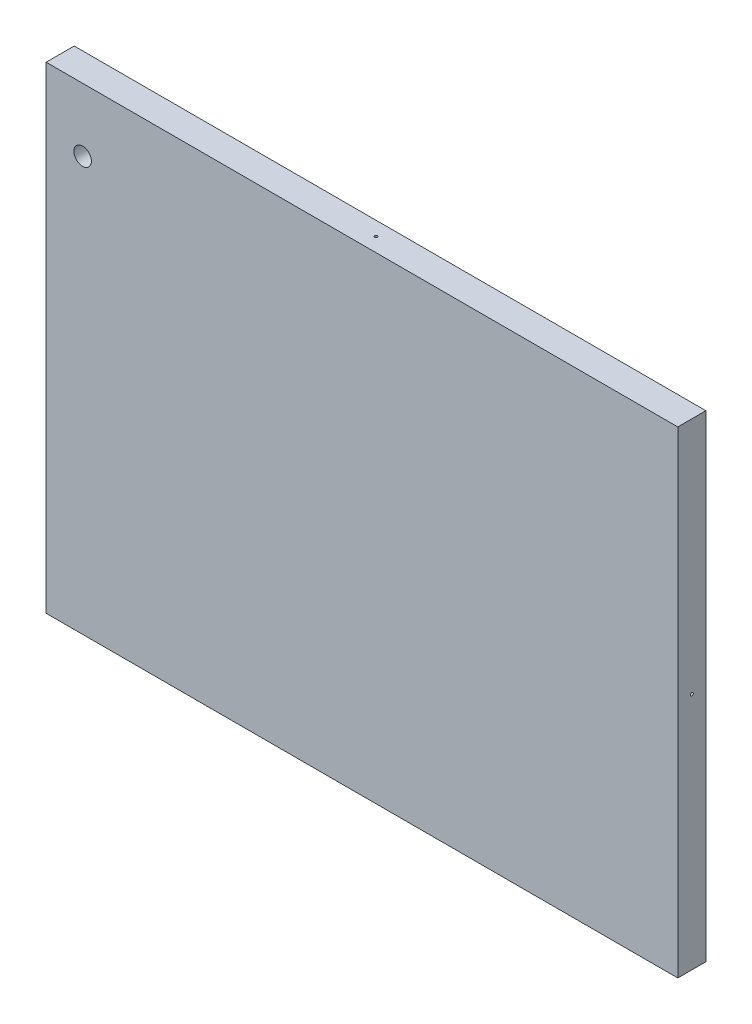
ISO-10303-21;
HEADER;
FILE_DESCRIPTION(('STEP AP214'),'2;1');
FILE_NAME('part.step','',(''),(''),'','','');
FILE_SCHEMA(('AUTOMOTIVE_DESIGN { 1 0 10303 214 1 1 1 1 }'));
ENDSEC;
DATA;
#1=APPLICATION_CONTEXT('core data for automotive mechanical design processes');
#2=APPLICATION_PROTOCOL_DEFINITION('international standard','automotive_design',2000,#1);
#3=PRODUCT_CONTEXT('',#1,'mechanical');
#4=PRODUCT('Part','Part','',(#3));
#5=PRODUCT_RELATED_PRODUCT_CATEGORY('part','',(#4));
#6=PRODUCT_DEFINITION_FORMATION('','',#4);
#7=PRODUCT_DEFINITION_CONTEXT('part definition',#1,'design');
#8=PRODUCT_DEFINITION('design','',#6,#7);
#9=PRODUCT_DEFINITION_SHAPE('','',#8);
#10=(LENGTH_UNIT() NAMED_UNIT(*) SI_UNIT(.MILLI.,.METRE.));
#11=(NAMED_UNIT(*) PLANE_ANGLE_UNIT() SI_UNIT($,.RADIAN.));
#12=(NAMED_UNIT(*) SI_UNIT($,.STERADIAN.) SOLID_ANGLE_UNIT());
#13=UNCERTAINTY_MEASURE_WITH_UNIT(LENGTH_MEASURE(1.E-05),#10,'distance_accuracy_value','');
#14=(GEOMETRIC_REPRESENTATION_CONTEXT(3) GLOBAL_UNCERTAINTY_ASSIGNED_CONTEXT((#13)) GLOBAL_UNIT_ASSIGNED_CONTEXT((#10,
#11,#12)) REPRESENTATION_CONTEXT('',''));
#15=CARTESIAN_POINT('',(0.,0.,0.));
#16=DIRECTION('',(0.,0.,1.));
#17=DIRECTION('',(1.,0.,0.));
#18=AXIS2_PLACEMENT_3D('',#15,#16,#17);
#19=CARTESIAN_POINT('',(0.,-340.,20.));
#20=DIRECTION('',(0.,-1.,0.));
#21=DIRECTION('',(0.,0.,-1.));
#22=AXIS2_PLACEMENT_3D('',#19,#20,#21);
#23=CYLINDRICAL_SURFACE('',#22,2.09999999999992);
#24=CARTESIAN_POINT('',(0.,-340.,20.));
#25=DIRECTION('',(0.,-1.,0.));
#26=DIRECTION('',(0.,0.,-1.));
#27=AXIS2_PLACEMENT_3D('',#24,#25,#26);
#28=CIRCLE('',#27,2.09999999999999);
#29=CARTESIAN_POINT('',(0.,-340.,17.9));
#30=VERTEX_POINT('',#29);
#31=EDGE_CURVE('E134',#30,#30,#28,.T.);
#32=ORIENTED_EDGE('',*,*,#31,.T.);
#33=EDGE_LOOP('',(#32));
#34=FACE_BOUND('',#33,.T.);
#35=CARTESIAN_POINT('',(0.,0.,20.));
#36=DIRECTION('',(0.707106781186547,-0.707106781186547,0.));
#37=DIRECTION('',(-0.707106781186547,-0.707106781186547,0.));
#38=AXIS2_PLACEMENT_3D('',#35,#36,#37);
#39=ELLIPSE('',#38,2.9698484809834,2.09999999999993);
#40=CARTESIAN_POINT('',(0.,0.,17.9000000000001));
#41=VERTEX_POINT('',#40);
#42=CARTESIAN_POINT('',(0.,0.,22.0999999999999));
#43=VERTEX_POINT('',#42);
#44=EDGE_CURVE('E53',#41,#43,#39,.F.);
#45=ORIENTED_EDGE('',*,*,#44,.T.);
#46=CARTESIAN_POINT('',(0.,0.,20.));
#47=DIRECTION('',(-0.707106781186547,-0.707106781186547,0.));
#48=DIRECTION('',(0.707106781186547,-0.707106781186547,0.));
#49=AXIS2_PLACEMENT_3D('',#46,#47,#48);
#50=ELLIPSE('',#49,2.9698484809834,2.09999999999993);
#51=EDGE_CURVE('E11',#43,#41,#50,.F.);
#52=ORIENTED_EDGE('',*,*,#51,.T.);
#53=EDGE_LOOP('',(#45,#52));
#54=FACE_BOUND('',#53,.T.);
#55=ADVANCED_FACE('F40',(#34,#54),#23,.F.);
#56=CARTESIAN_POINT('',(450.,340.,40.));
#57=DIRECTION('',(-1.,0.,0.));
#58=DIRECTION('',(0.,-1.,0.));
#59=AXIS2_PLACEMENT_3D('',#56,#57,#58);
#60=PLANE('',#59);
#61=CARTESIAN_POINT('',(450.,0.,20.));
#62=DIRECTION('',(-1.,0.,0.));
#63=DIRECTION('',(0.,0.,1.));
#64=AXIS2_PLACEMENT_3D('',#61,#62,#63);
#65=CIRCLE('',#64,2.09999999999989);
#66=CARTESIAN_POINT('',(450.,0.,22.0999999999999));
#67=VERTEX_POINT('',#66);
#68=EDGE_CURVE('E137',#67,#67,#65,.T.);
#69=ORIENTED_EDGE('',*,*,#68,.T.);
#70=EDGE_LOOP('',(#69));
#71=FACE_BOUND('',#70,.T.);
#72=DIRECTION('',(0.,1.,0.));
#73=VECTOR('',#72,1.);
#74=CARTESIAN_POINT('',(450.,340.,0.));
#75=LINE('',#74,#73);
#76=CARTESIAN_POINT('',(450.,-340.,0.));
#77=VERTEX_POINT('',#76);
#78=CARTESIAN_POINT('',(450.,340.,0.));
#79=VERTEX_POINT('',#78);
#80=EDGE_CURVE('E123',#77,#79,#75,.T.);
#81=ORIENTED_EDGE('',*,*,#80,.T.);
#82=DIRECTION('',(0.,0.,-1.));
#83=VECTOR('',#82,1.);
#84=CARTESIAN_POINT('',(450.,340.,40.));
#85=LINE('',#84,#83);
#86=CARTESIAN_POINT('',(450.,340.,40.));
#87=VERTEX_POINT('',#86);
#88=EDGE_CURVE('E104',#87,#79,#85,.T.);
#89=ORIENTED_EDGE('',*,*,#88,.F.);
#90=DIRECTION('',(0.,1.,0.));
#91=VECTOR('',#90,1.);
#92=CARTESIAN_POINT('',(450.,340.,40.));
#93=LINE('',#92,#91);
#94=CARTESIAN_POINT('',(450.,-340.,40.));
#95=VERTEX_POINT('',#94);
#96=EDGE_CURVE('E118',#95,#87,#93,.T.);
#97=ORIENTED_EDGE('',*,*,#96,.F.);
#98=DIRECTION('',(0.,0.,-1.));
#99=VECTOR('',#98,1.);
#100=CARTESIAN_POINT('',(450.,-340.,40.));
#101=LINE('',#100,#99);
#102=EDGE_CURVE('E115',#95,#77,#101,.T.);
#103=ORIENTED_EDGE('',*,*,#102,.T.);
#104=EDGE_LOOP('',(#81,#89,#97,#103));
#105=FACE_BOUND('',#104,.T.);
#106=ADVANCED_FACE('F42',(#71,#105),#60,.F.);
#107=CARTESIAN_POINT('',(-450.,340.,40.));
#108=DIRECTION('',(0.,-1.,0.));
#109=DIRECTION('',(0.,0.,-1.));
#110=AXIS2_PLACEMENT_3D('',#107,#108,#109);
#111=PLANE('',#110);
#112=CARTESIAN_POINT('',(0.,340.,20.));
#113=DIRECTION('',(0.,-1.,0.));
#114=DIRECTION('',(0.,0.,-1.));
#115=AXIS2_PLACEMENT_3D('',#112,#113,#114);
#116=CIRCLE('',#115,2.09999999999984);
#117=CARTESIAN_POINT('',(0.,340.,17.9000000000002));
#118=VERTEX_POINT('',#117);
#119=EDGE_CURVE('E126',#118,#118,#116,.T.);
#120=ORIENTED_EDGE('',*,*,#119,.T.);
#121=EDGE_LOOP('',(#120));
#122=FACE_BOUND('',#121,.T.);
#123=DIRECTION('',(-1.,0.,0.));
#124=VECTOR('',#123,1.);
#125=CARTESIAN_POINT('',(-450.,340.,0.));
#126=LINE('',#125,#124);
#127=CARTESIAN_POINT('',(-450.,340.,0.));
#128=VERTEX_POINT('',#127);
#129=EDGE_CURVE('E121',#79,#128,#126,.T.);
#130=ORIENTED_EDGE('',*,*,#129,.T.);
#131=DIRECTION('',(0.,0.,-1.));
#132=VECTOR('',#131,1.);
#133=CARTESIAN_POINT('',(-450.,340.,40.));
#134=LINE('',#133,#132);
#135=CARTESIAN_POINT('',(-450.,340.,40.));
#136=VERTEX_POINT('',#135);
#137=EDGE_CURVE('E110',#136,#128,#134,.T.);
#138=ORIENTED_EDGE('',*,*,#137,.F.);
#139=DIRECTION('',(-1.,0.,0.));
#140=VECTOR('',#139,1.);
#141=CARTESIAN_POINT('',(-450.,340.,40.));
#142=LINE('',#141,#140);
#143=EDGE_CURVE('E91',#87,#136,#142,.T.);
#144=ORIENTED_EDGE('',*,*,#143,.F.);
#145=ORIENTED_EDGE('',*,*,#88,.T.);
#146=EDGE_LOOP('',(#130,#138,#144,#145));
#147=FACE_BOUND('',#146,.T.);
#148=ADVANCED_FACE('F167',(#122,#147),#111,.F.);
#149=CARTESIAN_POINT('',(-450.,340.,40.));
#150=DIRECTION('',(1.,0.,0.));
#151=DIRECTION('',(0.,1.,0.));
#152=AXIS2_PLACEMENT_3D('',#149,#150,#151);
#153=PLANE('',#152);
#154=CARTESIAN_POINT('',(-450.,0.,20.));
#155=DIRECTION('',(-1.,0.,0.));
#156=DIRECTION('',(0.,0.,1.));
#157=AXIS2_PLACEMENT_3D('',#154,#155,#156);
#158=CIRCLE('',#157,2.09999999999999);
#159=CARTESIAN_POINT('',(-450.,0.,22.1));
#160=VERTEX_POINT('',#159);
#161=EDGE_CURVE('E140',#160,#160,#158,.T.);
#162=ORIENTED_EDGE('',*,*,#161,.F.);
#163=EDGE_LOOP('',(#162));
#164=FACE_BOUND('',#163,.T.);
#165=DIRECTION('',(0.,-1.,0.));
#166=VECTOR('',#165,1.);
#167=CARTESIAN_POINT('',(-450.,340.,0.));
#168=LINE('',#167,#166);
#169=CARTESIAN_POINT('',(-450.,-340.,0.));
#170=VERTEX_POINT('',#169);
#171=EDGE_CURVE('E119',#128,#170,#168,.T.);
#172=ORIENTED_EDGE('',*,*,#171,.T.);
#173=DIRECTION('',(0.,0.,-1.));
#174=VECTOR('',#173,1.);
#175=CARTESIAN_POINT('',(-450.,-340.,40.));
#176=LINE('',#175,#174);
#177=CARTESIAN_POINT('',(-450.,-340.,40.));
#178=VERTEX_POINT('',#177);
#179=EDGE_CURVE('E113',#178,#170,#176,.T.);
#180=ORIENTED_EDGE('',*,*,#179,.F.);
#181=DIRECTION('',(0.,-1.,0.));
#182=VECTOR('',#181,1.);
#183=CARTESIAN_POINT('',(-450.,340.,40.));
#184=LINE('',#183,#182);
#185=EDGE_CURVE('E128',#136,#178,#184,.T.);
#186=ORIENTED_EDGE('',*,*,#185,.F.);
#187=ORIENTED_EDGE('',*,*,#137,.T.);
#188=EDGE_LOOP('',(#172,#180,#186,#187));
#189=FACE_BOUND('',#188,.T.);
#190=ADVANCED_FACE('F171',(#164,#189),#153,.F.);
#191=CARTESIAN_POINT('',(-450.,-340.,40.));
#192=DIRECTION('',(0.,1.,0.));
#193=DIRECTION('',(0.,0.,1.));
#194=AXIS2_PLACEMENT_3D('',#191,#192,#193);
#195=PLANE('',#194);
#196=ORIENTED_EDGE('',*,*,#31,.F.);
#197=EDGE_LOOP('',(#196));
#198=FACE_BOUND('',#197,.T.);
#199=DIRECTION('',(1.,0.,0.));
#200=VECTOR('',#199,1.);
#201=CARTESIAN_POINT('',(-450.,-340.,0.));
#202=LINE('',#201,#200);
#203=EDGE_CURVE('E83',#170,#77,#202,.T.);
#204=ORIENTED_EDGE('',*,*,#203,.T.);
#205=ORIENTED_EDGE('',*,*,#102,.F.);
#206=DIRECTION('',(1.,0.,0.));
#207=VECTOR('',#206,1.);
#208=CARTESIAN_POINT('',(-450.,-340.,40.));
#209=LINE('',#208,#207);
#210=EDGE_CURVE('E62',#178,#95,#209,.T.);
#211=ORIENTED_EDGE('',*,*,#210,.F.);
#212=ORIENTED_EDGE('',*,*,#179,.T.);
#213=EDGE_LOOP('',(#204,#205,#211,#212));
#214=FACE_BOUND('',#213,.T.);
#215=ADVANCED_FACE('F161',(#198,#214),#195,.F.);
#216=CARTESIAN_POINT('',(0.,0.,40.));
#217=DIRECTION('',(0.,0.,1.));
#218=DIRECTION('',(1.,0.,0.));
#219=AXIS2_PLACEMENT_3D('',#216,#217,#218);
#220=PLANE('',#219);
#221=CARTESIAN_POINT('',(-398.,250.,40.));
#222=DIRECTION('',(0.,0.,1.));
#223=DIRECTION('',(1.,0.,0.));
#224=AXIS2_PLACEMENT_3D('',#221,#222,#223);
#225=CIRCLE('',#224,12.5);
#226=CARTESIAN_POINT('',(-385.5,250.,40.));
#227=VERTEX_POINT('',#226);
#228=EDGE_CURVE('E144',#227,#227,#225,.T.);
#229=ORIENTED_EDGE('',*,*,#228,.F.);
#230=EDGE_LOOP('',(#229));
#231=FACE_BOUND('',#230,.T.);
#232=ORIENTED_EDGE('',*,*,#96,.T.);
#233=ORIENTED_EDGE('',*,*,#143,.T.);
#234=ORIENTED_EDGE('',*,*,#185,.T.);
#235=ORIENTED_EDGE('',*,*,#210,.T.);
#236=EDGE_LOOP('',(#232,#233,#234,#235));
#237=FACE_BOUND('',#236,.T.);
#238=ADVANCED_FACE('F159',(#231,#237),#220,.T.);
#239=CARTESIAN_POINT('',(0.,0.,0.));
#240=DIRECTION('',(0.,0.,1.));
#241=DIRECTION('',(1.,0.,0.));
#242=AXIS2_PLACEMENT_3D('',#239,#240,#241);
#243=PLANE('',#242);
#244=CARTESIAN_POINT('',(-398.,250.,0.));
#245=DIRECTION('',(0.,0.,1.));
#246=DIRECTION('',(1.,0.,0.));
#247=AXIS2_PLACEMENT_3D('',#244,#245,#246);
#248=CIRCLE('',#247,12.5);
#249=CARTESIAN_POINT('',(-385.5,250.,0.));
#250=VERTEX_POINT('',#249);
#251=EDGE_CURVE('E143',#250,#250,#248,.T.);
#252=ORIENTED_EDGE('',*,*,#251,.T.);
#253=EDGE_LOOP('',(#252));
#254=FACE_BOUND('',#253,.T.);
#255=ORIENTED_EDGE('',*,*,#80,.F.);
#256=ORIENTED_EDGE('',*,*,#203,.F.);
#257=ORIENTED_EDGE('',*,*,#171,.F.);
#258=ORIENTED_EDGE('',*,*,#129,.F.);
#259=EDGE_LOOP('',(#255,#256,#257,#258));
#260=FACE_BOUND('',#259,.T.);
#261=ADVANCED_FACE('F150',(#254,#260),#243,.F.);
#262=CARTESIAN_POINT('',(0.,0.,20.));
#263=DIRECTION('',(0.707106781186547,-0.707106781186547,0.));
#264=DIRECTION('',(-0.707106781186547,-0.707106781186547,0.));
#265=AXIS2_PLACEMENT_3D('',#262,#263,#264);
#266=ELLIPSE('',#265,2.9698484809834,2.09999999999993);
#267=EDGE_CURVE('E97',#41,#43,#266,.T.);
#268=ORIENTED_EDGE('',*,*,#267,.T.);
#269=CARTESIAN_POINT('',(0.,0.,20.));
#270=DIRECTION('',(-0.707106781186547,-0.707106781186547,0.));
#271=DIRECTION('',(0.707106781186547,-0.707106781186547,0.));
#272=AXIS2_PLACEMENT_3D('',#269,#270,#271);
#273=ELLIPSE('',#272,2.9698484809834,2.09999999999993);
#274=EDGE_CURVE('E48',#43,#41,#273,.T.);
#275=ORIENTED_EDGE('',*,*,#274,.T.);
#276=EDGE_LOOP('',(#268,#275));
#277=FACE_BOUND('',#276,.T.);
#278=ORIENTED_EDGE('',*,*,#119,.F.);
#279=EDGE_LOOP('',(#278));
#280=FACE_BOUND('',#279,.T.);
#281=ADVANCED_FACE('F106',(#277,#280),#23,.F.);
#282=CARTESIAN_POINT('',(-450.,0.,20.));
#283=DIRECTION('',(-1.,0.,0.));
#284=DIRECTION('',(0.,0.,1.));
#285=AXIS2_PLACEMENT_3D('',#282,#283,#284);
#286=CYLINDRICAL_SURFACE('',#285,2.09999999999994);
#287=ORIENTED_EDGE('',*,*,#161,.T.);
#288=EDGE_LOOP('',(#287));
#289=FACE_BOUND('',#288,.T.);
#290=ORIENTED_EDGE('',*,*,#44,.F.);
#291=ORIENTED_EDGE('',*,*,#274,.F.);
#292=EDGE_LOOP('',(#290,#291));
#293=FACE_BOUND('',#292,.T.);
#294=ADVANCED_FACE('F103',(#289,#293),#286,.F.);
#295=ORIENTED_EDGE('',*,*,#68,.F.);
#296=EDGE_LOOP('',(#295));
#297=FACE_BOUND('',#296,.T.);
#298=ORIENTED_EDGE('',*,*,#267,.F.);
#299=ORIENTED_EDGE('',*,*,#51,.F.);
#300=EDGE_LOOP('',(#298,#299));
#301=FACE_BOUND('',#300,.T.);
#302=ADVANCED_FACE('F98',(#297,#301),#286,.F.);
#303=CARTESIAN_POINT('',(-398.,250.,0.));
#304=DIRECTION('',(0.,0.,1.));
#305=DIRECTION('',(1.,0.,0.));
#306=AXIS2_PLACEMENT_3D('',#303,#304,#305);
#307=CYLINDRICAL_SURFACE('',#306,12.5);
#308=ORIENTED_EDGE('',*,*,#251,.F.);
#309=EDGE_LOOP('',(#308));
#310=FACE_BOUND('',#309,.T.);
#311=ORIENTED_EDGE('',*,*,#228,.T.);
#312=EDGE_LOOP('',(#311));
#313=FACE_BOUND('',#312,.T.);
#314=ADVANCED_FACE('F153',(#310,#313),#307,.F.);
#315=CLOSED_SHELL('',(#55,#106,#148,#190,#215,#238,#261,#281,#294,#302,#314));
#316=MANIFOLD_SOLID_BREP('B2',#315);
#317=ADVANCED_BREP_SHAPE_REPRESENTATION('',(#18,#316),#14);
#318=SHAPE_DEFINITION_REPRESENTATION(#9,#317);
ENDSEC;
END-ISO-10303-21;
